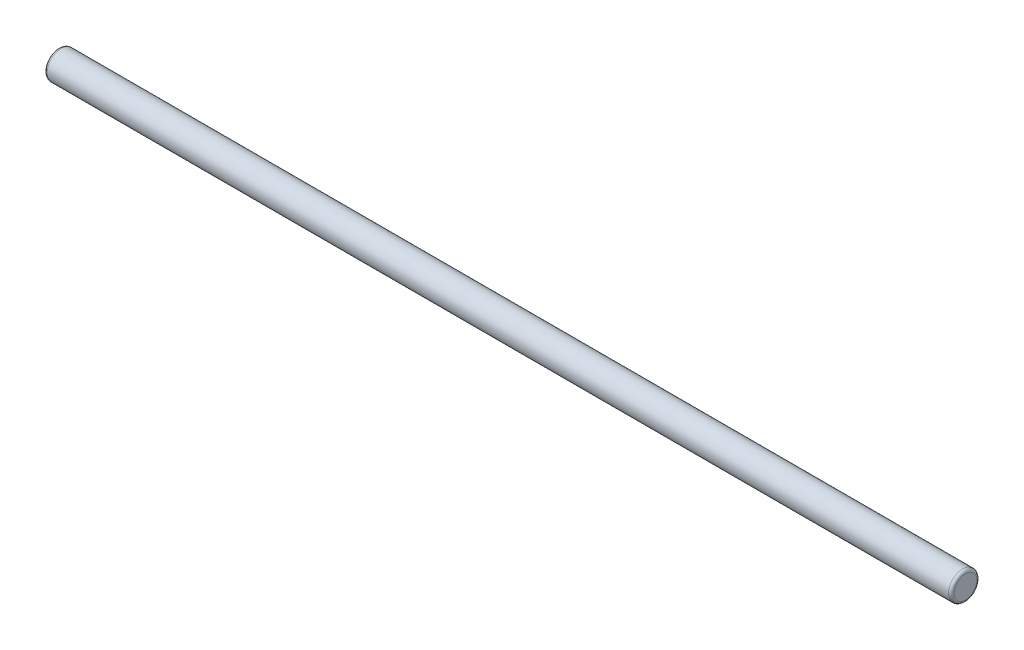
ISO-10303-21;
HEADER;
FILE_DESCRIPTION(('STEP AP214'),'2;1');
FILE_NAME('part.step','',(''),(''),'','','');
FILE_SCHEMA(('AUTOMOTIVE_DESIGN { 1 0 10303 214 1 1 1 1 }'));
ENDSEC;
DATA;
#1=APPLICATION_CONTEXT('core data for automotive mechanical design processes');
#2=APPLICATION_PROTOCOL_DEFINITION('international standard','automotive_design',2000,#1);
#3=PRODUCT_CONTEXT('',#1,'mechanical');
#4=PRODUCT('Part','Part','',(#3));
#5=PRODUCT_RELATED_PRODUCT_CATEGORY('part','',(#4));
#6=PRODUCT_DEFINITION_FORMATION('','',#4);
#7=PRODUCT_DEFINITION_CONTEXT('part definition',#1,'design');
#8=PRODUCT_DEFINITION('design','',#6,#7);
#9=PRODUCT_DEFINITION_SHAPE('','',#8);
#10=(LENGTH_UNIT() NAMED_UNIT(*) SI_UNIT(.MILLI.,.METRE.));
#11=(NAMED_UNIT(*) PLANE_ANGLE_UNIT() SI_UNIT($,.RADIAN.));
#12=(NAMED_UNIT(*) SI_UNIT($,.STERADIAN.) SOLID_ANGLE_UNIT());
#13=UNCERTAINTY_MEASURE_WITH_UNIT(LENGTH_MEASURE(1.E-05),#10,'distance_accuracy_value','');
#14=(GEOMETRIC_REPRESENTATION_CONTEXT(3) GLOBAL_UNCERTAINTY_ASSIGNED_CONTEXT((#13)) GLOBAL_UNIT_ASSIGNED_CONTEXT((#10,
#11,#12)) REPRESENTATION_CONTEXT('',''));
#15=CARTESIAN_POINT('',(0.,0.,0.));
#16=DIRECTION('',(0.,0.,1.));
#17=DIRECTION('',(1.,0.,0.));
#18=AXIS2_PLACEMENT_3D('',#15,#16,#17);
#19=CARTESIAN_POINT('',(-812.8,0.,0.));
#20=DIRECTION('',(1.,0.,0.));
#21=DIRECTION('',(0.,0.,-1.));
#22=AXIS2_PLACEMENT_3D('',#19,#20,#21);
#23=CYLINDRICAL_SURFACE('',#22,12.7);
#24=CARTESIAN_POINT('',(-2.53999999999999,0.,0.));
#25=DIRECTION('',(1.,0.,0.));
#26=DIRECTION('',(0.,0.,-1.));
#27=AXIS2_PLACEMENT_3D('',#24,#25,#26);
#28=CIRCLE('',#27,12.7);
#29=CARTESIAN_POINT('',(-2.53999999999999,0.,-12.7));
#30=VERTEX_POINT('',#29);
#31=EDGE_CURVE('E38',#30,#30,#28,.F.);
#32=ORIENTED_EDGE('',*,*,#31,.T.);
#33=EDGE_LOOP('',(#32));
#34=FACE_BOUND('',#33,.T.);
#35=CARTESIAN_POINT('',(-810.26,0.,0.));
#36=DIRECTION('',(1.,0.,0.));
#37=DIRECTION('',(0.,0.,-1.));
#38=AXIS2_PLACEMENT_3D('',#35,#36,#37);
#39=CIRCLE('',#38,12.7);
#40=CARTESIAN_POINT('',(-810.26,0.,-12.7));
#41=VERTEX_POINT('',#40);
#42=EDGE_CURVE('E42',#41,#41,#39,.T.);
#43=ORIENTED_EDGE('',*,*,#42,.T.);
#44=EDGE_LOOP('',(#43));
#45=FACE_BOUND('',#44,.T.);
#46=ADVANCED_FACE('F31',(#34,#45),#23,.T.);
#47=CARTESIAN_POINT('',(-812.8,0.,0.));
#48=DIRECTION('',(1.,0.,0.));
#49=DIRECTION('',(0.,0.,-1.));
#50=AXIS2_PLACEMENT_3D('',#47,#48,#49);
#51=PLANE('',#50);
#52=CARTESIAN_POINT('',(-812.8,0.,0.));
#53=DIRECTION('',(1.,0.,0.));
#54=DIRECTION('',(0.,0.,-1.));
#55=AXIS2_PLACEMENT_3D('',#52,#53,#54);
#56=CIRCLE('',#55,10.16);
#57=CARTESIAN_POINT('',(-812.8,0.,-10.16));
#58=VERTEX_POINT('',#57);
#59=EDGE_CURVE('E10',#58,#58,#56,.F.);
#60=ORIENTED_EDGE('',*,*,#59,.T.);
#61=EDGE_LOOP('',(#60));
#62=FACE_BOUND('',#61,.T.);
#63=ADVANCED_FACE('F62',(#62),#51,.F.);
#64=CARTESIAN_POINT('',(0.,0.,0.));
#65=DIRECTION('',(1.,0.,0.));
#66=DIRECTION('',(0.,0.,-1.));
#67=AXIS2_PLACEMENT_3D('',#64,#65,#66);
#68=PLANE('',#67);
#69=CARTESIAN_POINT('',(0.,0.,0.));
#70=DIRECTION('',(1.,0.,0.));
#71=DIRECTION('',(0.,0.,-1.));
#72=AXIS2_PLACEMENT_3D('',#69,#70,#71);
#73=CIRCLE('',#72,10.16);
#74=CARTESIAN_POINT('',(0.,0.,-10.16));
#75=VERTEX_POINT('',#74);
#76=EDGE_CURVE('E46',#75,#75,#73,.T.);
#77=ORIENTED_EDGE('',*,*,#76,.T.);
#78=EDGE_LOOP('',(#77));
#79=FACE_BOUND('',#78,.T.);
#80=ADVANCED_FACE('F52',(#79),#68,.T.);
#81=CARTESIAN_POINT('',(-2.53999999999999,0.,0.));
#82=DIRECTION('',(1.,0.,0.));
#83=DIRECTION('',(0.,0.,-1.));
#84=AXIS2_PLACEMENT_3D('',#81,#82,#83);
#85=TOROIDAL_SURFACE('',#84,10.16,2.54);
#86=ORIENTED_EDGE('',*,*,#31,.F.);
#87=EDGE_LOOP('',(#86));
#88=FACE_BOUND('',#87,.T.);
#89=ORIENTED_EDGE('',*,*,#76,.F.);
#90=EDGE_LOOP('',(#89));
#91=FACE_BOUND('',#90,.T.);
#92=ADVANCED_FACE('F54',(#88,#91),#85,.T.);
#93=CARTESIAN_POINT('',(-810.26,0.,0.));
#94=DIRECTION('',(1.,0.,0.));
#95=DIRECTION('',(0.,0.,-1.));
#96=AXIS2_PLACEMENT_3D('',#93,#94,#95);
#97=TOROIDAL_SURFACE('',#96,10.16,2.54);
#98=ORIENTED_EDGE('',*,*,#59,.F.);
#99=EDGE_LOOP('',(#98));
#100=FACE_BOUND('',#99,.T.);
#101=ORIENTED_EDGE('',*,*,#42,.F.);
#102=EDGE_LOOP('',(#101));
#103=FACE_BOUND('',#102,.T.);
#104=ADVANCED_FACE('F33',(#100,#103),#97,.T.);
#105=CLOSED_SHELL('',(#46,#63,#80,#92,#104));
#106=MANIFOLD_SOLID_BREP('B2',#105);
#107=ADVANCED_BREP_SHAPE_REPRESENTATION('',(#18,#106),#14);
#108=SHAPE_DEFINITION_REPRESENTATION(#9,#107);
ENDSEC;
END-ISO-10303-21;
